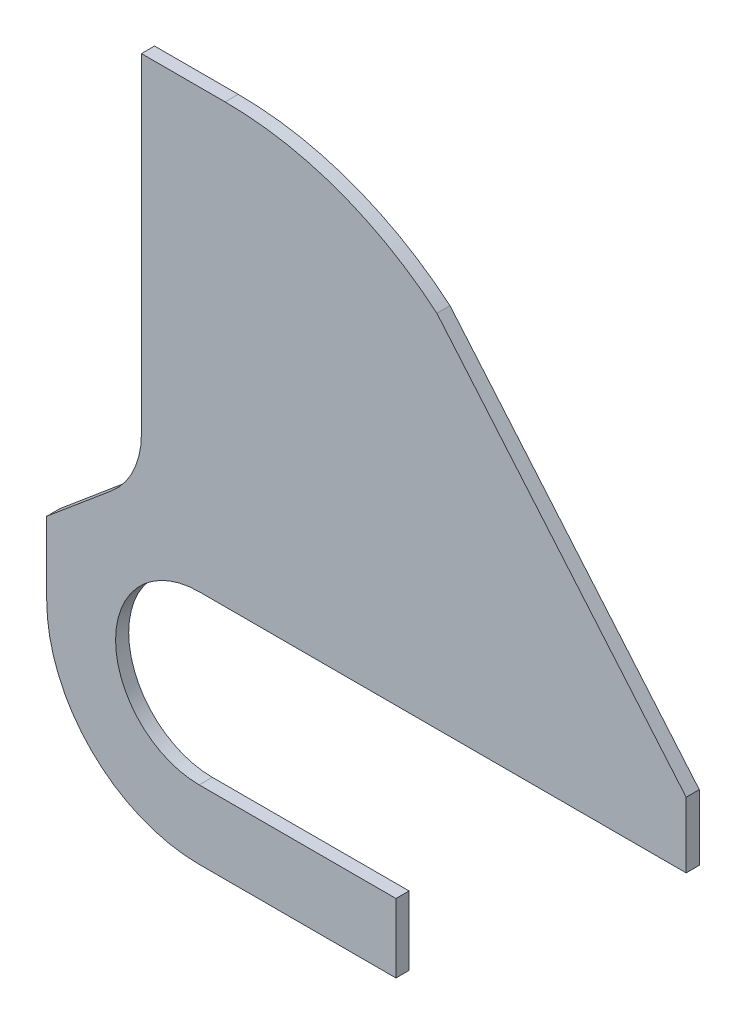
ISO-10303-21;
HEADER;
FILE_DESCRIPTION(('STEP AP214'),'2;1');
FILE_NAME('part.step','',(''),(''),'','','');
FILE_SCHEMA(('AUTOMOTIVE_DESIGN { 1 0 10303 214 1 1 1 1 }'));
ENDSEC;
DATA;
#1=APPLICATION_CONTEXT('core data for automotive mechanical design processes');
#2=APPLICATION_PROTOCOL_DEFINITION('international standard','automotive_design',2000,#1);
#3=PRODUCT_CONTEXT('',#1,'mechanical');
#4=PRODUCT('Part','Part','',(#3));
#5=PRODUCT_RELATED_PRODUCT_CATEGORY('part','',(#4));
#6=PRODUCT_DEFINITION_FORMATION('','',#4);
#7=PRODUCT_DEFINITION_CONTEXT('part definition',#1,'design');
#8=PRODUCT_DEFINITION('design','',#6,#7);
#9=PRODUCT_DEFINITION_SHAPE('','',#8);
#10=(LENGTH_UNIT() NAMED_UNIT(*) SI_UNIT(.MILLI.,.METRE.));
#11=(NAMED_UNIT(*) PLANE_ANGLE_UNIT() SI_UNIT($,.RADIAN.));
#12=(NAMED_UNIT(*) SI_UNIT($,.STERADIAN.) SOLID_ANGLE_UNIT());
#13=UNCERTAINTY_MEASURE_WITH_UNIT(LENGTH_MEASURE(1.E-05),#10,'distance_accuracy_value','');
#14=(GEOMETRIC_REPRESENTATION_CONTEXT(3) GLOBAL_UNCERTAINTY_ASSIGNED_CONTEXT((#13)) GLOBAL_UNIT_ASSIGNED_CONTEXT((#10,
#11,#12)) REPRESENTATION_CONTEXT('',''));
#15=CARTESIAN_POINT('',(0.,0.,0.));
#16=DIRECTION('',(0.,0.,1.));
#17=DIRECTION('',(1.,0.,0.));
#18=AXIS2_PLACEMENT_3D('',#15,#16,#17);
#19=CARTESIAN_POINT('',(-692.36812322296,756.238006891111,4.));
#20=DIRECTION('',(0.,-1.,0.));
#21=DIRECTION('',(0.,0.,-1.));
#22=AXIS2_PLACEMENT_3D('',#19,#20,#21);
#23=PLANE('',#22);
#24=DIRECTION('',(-1.,0.,0.));
#25=VECTOR('',#24,1.);
#26=CARTESIAN_POINT('',(-692.36812322296,756.238006891111,-4.));
#27=LINE('',#26,#25);
#28=CARTESIAN_POINT('',(-692.36812322296,756.238006891111,-4.));
#29=VERTEX_POINT('',#28);
#30=CARTESIAN_POINT('',(-812.36812322296,756.238006891111,-4.));
#31=VERTEX_POINT('',#30);
#32=EDGE_CURVE('E175',#29,#31,#27,.T.);
#33=ORIENTED_EDGE('',*,*,#32,.T.);
#34=DIRECTION('',(0.,0.,-1.));
#35=VECTOR('',#34,1.);
#36=CARTESIAN_POINT('',(-812.36812322296,756.238006891111,4.));
#37=LINE('',#36,#35);
#38=CARTESIAN_POINT('',(-812.36812322296,756.238006891111,4.));
#39=VERTEX_POINT('',#38);
#40=EDGE_CURVE('E11',#39,#31,#37,.T.);
#41=ORIENTED_EDGE('',*,*,#40,.F.);
#42=DIRECTION('',(-1.,0.,0.));
#43=VECTOR('',#42,1.);
#44=CARTESIAN_POINT('',(-692.36812322296,756.238006891111,4.));
#45=LINE('',#44,#43);
#46=CARTESIAN_POINT('',(-692.36812322296,756.238006891111,4.));
#47=VERTEX_POINT('',#46);
#48=EDGE_CURVE('E201',#47,#39,#45,.T.);
#49=ORIENTED_EDGE('',*,*,#48,.F.);
#50=DIRECTION('',(0.,0.,-1.));
#51=VECTOR('',#50,1.);
#52=CARTESIAN_POINT('',(-692.36812322296,756.238006891111,4.));
#53=LINE('',#52,#51);
#54=EDGE_CURVE('E171',#47,#29,#53,.T.);
#55=ORIENTED_EDGE('',*,*,#54,.T.);
#56=EDGE_LOOP('',(#33,#41,#49,#55));
#57=FACE_BOUND('',#56,.T.);
#58=ADVANCED_FACE('F43',(#57),#23,.F.);
#59=CARTESIAN_POINT('',(-812.368123222959,807.238006891111,4.));
#60=DIRECTION('',(0.,0.,-1.));
#61=DIRECTION('',(-1.,0.,0.));
#62=AXIS2_PLACEMENT_3D('',#59,#60,#61);
#63=CYLINDRICAL_SURFACE('',#62,51.);
#64=CARTESIAN_POINT('',(-812.368123222959,807.238006891111,-4.));
#65=DIRECTION('',(0.,0.,-1.));
#66=DIRECTION('',(-1.,0.,0.));
#67=AXIS2_PLACEMENT_3D('',#64,#65,#66);
#68=CIRCLE('',#67,51.);
#69=CARTESIAN_POINT('',(-812.368123222959,858.238006891111,-4.));
#70=VERTEX_POINT('',#69);
#71=EDGE_CURVE('E178',#31,#70,#68,.T.);
#72=ORIENTED_EDGE('',*,*,#71,.T.);
#73=DIRECTION('',(0.,0.,-1.));
#74=VECTOR('',#73,1.);
#75=CARTESIAN_POINT('',(-812.368123222959,858.238006891111,4.));
#76=LINE('',#75,#74);
#77=CARTESIAN_POINT('',(-812.368123222959,858.238006891111,4.));
#78=VERTEX_POINT('',#77);
#79=EDGE_CURVE('E51',#78,#70,#76,.T.);
#80=ORIENTED_EDGE('',*,*,#79,.F.);
#81=CARTESIAN_POINT('',(-812.368123222959,807.238006891111,4.));
#82=DIRECTION('',(0.,0.,-1.));
#83=DIRECTION('',(-1.,0.,0.));
#84=AXIS2_PLACEMENT_3D('',#81,#82,#83);
#85=CIRCLE('',#84,51.);
#86=EDGE_CURVE('E120',#39,#78,#85,.T.);
#87=ORIENTED_EDGE('',*,*,#86,.F.);
#88=ORIENTED_EDGE('',*,*,#40,.T.);
#89=EDGE_LOOP('',(#72,#80,#87,#88));
#90=FACE_BOUND('',#89,.T.);
#91=ADVANCED_FACE('F289',(#90),#63,.F.);
#92=CARTESIAN_POINT('',(-812.368123222959,858.238006891111,4.));
#93=DIRECTION('',(0.,1.,0.));
#94=DIRECTION('',(-1.,0.,0.));
#95=AXIS2_PLACEMENT_3D('',#92,#93,#94);
#96=PLANE('',#95);
#97=DIRECTION('',(1.,0.,0.));
#98=VECTOR('',#97,1.);
#99=CARTESIAN_POINT('',(-812.368123222959,858.238006891111,-4.));
#100=LINE('',#99,#98);
#101=CARTESIAN_POINT('',(-515.368123222948,858.2380068911,-4.));
#102=VERTEX_POINT('',#101);
#103=EDGE_CURVE('E180',#70,#102,#100,.T.);
#104=ORIENTED_EDGE('',*,*,#103,.T.);
#105=DIRECTION('',(0.,0.,-1.));
#106=VECTOR('',#105,1.);
#107=CARTESIAN_POINT('',(-515.368123222948,858.2380068911,4.));
#108=LINE('',#107,#106);
#109=CARTESIAN_POINT('',(-515.368123222948,858.2380068911,4.));
#110=VERTEX_POINT('',#109);
#111=EDGE_CURVE('E226',#110,#102,#108,.T.);
#112=ORIENTED_EDGE('',*,*,#111,.F.);
#113=DIRECTION('',(1.,0.,0.));
#114=VECTOR('',#113,1.);
#115=CARTESIAN_POINT('',(-812.368123222959,858.238006891111,4.));
#116=LINE('',#115,#114);
#117=EDGE_CURVE('E234',#78,#110,#116,.T.);
#118=ORIENTED_EDGE('',*,*,#117,.F.);
#119=ORIENTED_EDGE('',*,*,#79,.T.);
#120=EDGE_LOOP('',(#104,#112,#118,#119));
#121=FACE_BOUND('',#120,.T.);
#122=ADVANCED_FACE('F232',(#121),#96,.F.);
#123=CARTESIAN_POINT('',(-515.368123222948,858.2380068911,4.));
#124=DIRECTION('',(-1.,0.,0.));
#125=DIRECTION('',(0.,0.,1.));
#126=AXIS2_PLACEMENT_3D('',#123,#124,#125);
#127=PLANE('',#126);
#128=DIRECTION('',(0.,1.,0.));
#129=VECTOR('',#128,1.);
#130=CARTESIAN_POINT('',(-515.368123222948,858.2380068911,-4.));
#131=LINE('',#130,#129);
#132=CARTESIAN_POINT('',(-515.368123222948,898.238006891086,-4.));
#133=VERTEX_POINT('',#132);
#134=EDGE_CURVE('E182',#102,#133,#131,.T.);
#135=ORIENTED_EDGE('',*,*,#134,.T.);
#136=DIRECTION('',(0.,0.,-1.));
#137=VECTOR('',#136,1.);
#138=CARTESIAN_POINT('',(-515.368123222948,898.238006891086,4.));
#139=LINE('',#138,#137);
#140=CARTESIAN_POINT('',(-515.368123222948,898.238006891086,4.));
#141=VERTEX_POINT('',#140);
#142=EDGE_CURVE('E223',#141,#133,#139,.T.);
#143=ORIENTED_EDGE('',*,*,#142,.F.);
#144=DIRECTION('',(0.,1.,0.));
#145=VECTOR('',#144,1.);
#146=CARTESIAN_POINT('',(-515.368123222948,858.2380068911,4.));
#147=LINE('',#146,#145);
#148=EDGE_CURVE('E252',#110,#141,#147,.T.);
#149=ORIENTED_EDGE('',*,*,#148,.F.);
#150=ORIENTED_EDGE('',*,*,#111,.T.);
#151=EDGE_LOOP('',(#135,#143,#149,#150));
#152=FACE_BOUND('',#151,.T.);
#153=ADVANCED_FACE('F243',(#152),#127,.F.);
#154=CARTESIAN_POINT('',(-667.419030076104,1077.86407610393,4.));
#155=DIRECTION('',(-0.763261355733497,-0.646089856632857,0.));
#156=DIRECTION('',(0.646089856632857,-0.763261355733497,0.));
#157=AXIS2_PLACEMENT_3D('',#154,#155,#156);
#158=PLANE('',#157);
#159=DIRECTION('',(-0.646089856632856,0.763261355733496,0.));
#160=VECTOR('',#159,1.);
#161=CARTESIAN_POINT('',(-667.419030076104,1077.86407610393,-4.));
#162=LINE('',#161,#160);
#163=CARTESIAN_POINT('',(-667.419030076104,1077.86407610393,-4.));
#164=VERTEX_POINT('',#163);
#165=EDGE_CURVE('E184',#133,#164,#162,.T.);
#166=ORIENTED_EDGE('',*,*,#165,.T.);
#167=DIRECTION('',(0.,0.,-1.));
#168=VECTOR('',#167,1.);
#169=CARTESIAN_POINT('',(-667.419030076104,1077.86407610393,4.));
#170=LINE('',#169,#168);
#171=CARTESIAN_POINT('',(-667.419030076104,1077.86407610393,4.));
#172=VERTEX_POINT('',#171);
#173=EDGE_CURVE('E220',#172,#164,#170,.T.);
#174=ORIENTED_EDGE('',*,*,#173,.F.);
#175=DIRECTION('',(-0.646089856632856,0.763261355733496,0.));
#176=VECTOR('',#175,1.);
#177=CARTESIAN_POINT('',(-667.419030076104,1077.86407610393,4.));
#178=LINE('',#177,#176);
#179=EDGE_CURVE('E249',#141,#172,#178,.T.);
#180=ORIENTED_EDGE('',*,*,#179,.F.);
#181=ORIENTED_EDGE('',*,*,#142,.T.);
#182=EDGE_LOOP('',(#166,#174,#180,#181));
#183=FACE_BOUND('',#182,.T.);
#184=ADVANCED_FACE('F247',(#183),#158,.F.);
#185=CARTESIAN_POINT('',(-796.619339623095,923.889143037008,4.));
#186=DIRECTION('',(0.,0.,-1.));
#187=DIRECTION('',(-1.,0.,0.));
#188=AXIS2_PLACEMENT_3D('',#185,#186,#187);
#189=CYLINDRICAL_SURFACE('',#188,201.);
#190=CARTESIAN_POINT('',(-796.619339623095,923.889143037008,-4.));
#191=DIRECTION('',(0.,0.,1.));
#192=DIRECTION('',(1.,0.,0.));
#193=AXIS2_PLACEMENT_3D('',#190,#191,#192);
#194=CIRCLE('',#193,201.);
#195=CARTESIAN_POINT('',(-796.619339623097,1124.88914303701,-4.));
#196=VERTEX_POINT('',#195);
#197=EDGE_CURVE('E186',#164,#196,#194,.T.);
#198=ORIENTED_EDGE('',*,*,#197,.T.);
#199=DIRECTION('',(0.,0.,-1.));
#200=VECTOR('',#199,1.);
#201=CARTESIAN_POINT('',(-796.619339623097,1124.88914303701,4.));
#202=LINE('',#201,#200);
#203=CARTESIAN_POINT('',(-796.619339623097,1124.88914303701,4.));
#204=VERTEX_POINT('',#203);
#205=EDGE_CURVE('E217',#204,#196,#202,.T.);
#206=ORIENTED_EDGE('',*,*,#205,.F.);
#207=CARTESIAN_POINT('',(-796.619339623095,923.889143037008,4.));
#208=DIRECTION('',(0.,0.,1.));
#209=DIRECTION('',(1.,0.,0.));
#210=AXIS2_PLACEMENT_3D('',#207,#208,#209);
#211=CIRCLE('',#210,201.);
#212=EDGE_CURVE('E251',#172,#204,#211,.T.);
#213=ORIENTED_EDGE('',*,*,#212,.F.);
#214=ORIENTED_EDGE('',*,*,#173,.T.);
#215=EDGE_LOOP('',(#198,#206,#213,#214));
#216=FACE_BOUND('',#215,.T.);
#217=ADVANCED_FACE('F302',(#216),#189,.T.);
#218=CARTESIAN_POINT('',(-847.619339623095,1124.88914303701,4.));
#219=DIRECTION('',(0.,-1.,0.));
#220=DIRECTION('',(0.,0.,-1.));
#221=AXIS2_PLACEMENT_3D('',#218,#219,#220);
#222=PLANE('',#221);
#223=DIRECTION('',(-1.,0.,0.));
#224=VECTOR('',#223,1.);
#225=CARTESIAN_POINT('',(-847.619339623095,1124.88914303701,-4.));
#226=LINE('',#225,#224);
#227=CARTESIAN_POINT('',(-847.619339623095,1124.88914303701,-4.));
#228=VERTEX_POINT('',#227);
#229=EDGE_CURVE('E188',#196,#228,#226,.T.);
#230=ORIENTED_EDGE('',*,*,#229,.T.);
#231=DIRECTION('',(0.,0.,-1.));
#232=VECTOR('',#231,1.);
#233=CARTESIAN_POINT('',(-847.619339623095,1124.88914303701,4.));
#234=LINE('',#233,#232);
#235=CARTESIAN_POINT('',(-847.619339623095,1124.88914303701,4.));
#236=VERTEX_POINT('',#235);
#237=EDGE_CURVE('E214',#236,#228,#234,.T.);
#238=ORIENTED_EDGE('',*,*,#237,.F.);
#239=DIRECTION('',(-1.,0.,0.));
#240=VECTOR('',#239,1.);
#241=CARTESIAN_POINT('',(-847.619339623095,1124.88914303701,4.));
#242=LINE('',#241,#240);
#243=EDGE_CURVE('E254',#204,#236,#242,.T.);
#244=ORIENTED_EDGE('',*,*,#243,.F.);
#245=ORIENTED_EDGE('',*,*,#205,.T.);
#246=EDGE_LOOP('',(#230,#238,#244,#245));
#247=FACE_BOUND('',#246,.T.);
#248=ADVANCED_FACE('F305',(#247),#222,.F.);
#249=CARTESIAN_POINT('',(-847.619339623095,923.889143037008,4.));
#250=DIRECTION('',(1.,0.,0.));
#251=DIRECTION('',(0.,0.,-1.));
#252=AXIS2_PLACEMENT_3D('',#249,#250,#251);
#253=PLANE('',#252);
#254=DIRECTION('',(0.,-1.,0.));
#255=VECTOR('',#254,1.);
#256=CARTESIAN_POINT('',(-847.619339623095,923.889143037008,-4.));
#257=LINE('',#256,#255);
#258=CARTESIAN_POINT('',(-847.619339623095,923.889143037008,-4.));
#259=VERTEX_POINT('',#258);
#260=EDGE_CURVE('E190',#228,#259,#257,.T.);
#261=ORIENTED_EDGE('',*,*,#260,.T.);
#262=DIRECTION('',(0.,0.,-1.));
#263=VECTOR('',#262,1.);
#264=CARTESIAN_POINT('',(-847.619339623095,923.889143037008,4.));
#265=LINE('',#264,#263);
#266=CARTESIAN_POINT('',(-847.619339623095,923.889143037008,4.));
#267=VERTEX_POINT('',#266);
#268=EDGE_CURVE('E211',#267,#259,#265,.T.);
#269=ORIENTED_EDGE('',*,*,#268,.F.);
#270=DIRECTION('',(0.,-1.,0.));
#271=VECTOR('',#270,1.);
#272=CARTESIAN_POINT('',(-847.619339623095,923.889143037008,4.));
#273=LINE('',#272,#271);
#274=EDGE_CURVE('E260',#236,#267,#273,.T.);
#275=ORIENTED_EDGE('',*,*,#274,.F.);
#276=ORIENTED_EDGE('',*,*,#237,.T.);
#277=EDGE_LOOP('',(#261,#269,#275,#276));
#278=FACE_BOUND('',#277,.T.);
#279=ADVANCED_FACE('F309',(#278),#253,.F.);
#280=CARTESIAN_POINT('',(-898.619339623095,923.889143037008,4.));
#281=DIRECTION('',(0.,0.,-1.));
#282=DIRECTION('',(-1.,0.,0.));
#283=AXIS2_PLACEMENT_3D('',#280,#281,#282);
#284=CYLINDRICAL_SURFACE('',#283,51.);
#285=CARTESIAN_POINT('',(-898.619339623095,923.889143037008,-4.));
#286=DIRECTION('',(0.,0.,-1.));
#287=DIRECTION('',(-1.,0.,0.));
#288=AXIS2_PLACEMENT_3D('',#285,#286,#287);
#289=CIRCLE('',#288,51.);
#290=CARTESIAN_POINT('',(-865.837171529082,884.820876437939,-4.));
#291=VERTEX_POINT('',#290);
#292=EDGE_CURVE('E192',#259,#291,#289,.T.);
#293=ORIENTED_EDGE('',*,*,#292,.T.);
#294=DIRECTION('',(0.,0.,-1.));
#295=VECTOR('',#294,1.);
#296=CARTESIAN_POINT('',(-865.837171529082,884.820876437939,4.));
#297=LINE('',#296,#295);
#298=CARTESIAN_POINT('',(-865.837171529082,884.820876437939,4.));
#299=VERTEX_POINT('',#298);
#300=EDGE_CURVE('E208',#299,#291,#297,.T.);
#301=ORIENTED_EDGE('',*,*,#300,.F.);
#302=CARTESIAN_POINT('',(-898.619339623095,923.889143037008,4.));
#303=DIRECTION('',(0.,0.,-1.));
#304=DIRECTION('',(-1.,0.,0.));
#305=AXIS2_PLACEMENT_3D('',#302,#303,#304);
#306=CIRCLE('',#305,51.);
#307=EDGE_CURVE('E262',#267,#299,#306,.T.);
#308=ORIENTED_EDGE('',*,*,#307,.F.);
#309=ORIENTED_EDGE('',*,*,#268,.T.);
#310=EDGE_LOOP('',(#293,#301,#308,#309));
#311=FACE_BOUND('',#310,.T.);
#312=ADVANCED_FACE('F313',(#311),#284,.F.);
#313=CARTESIAN_POINT('',(-905.368123222959,851.650469451522,4.));
#314=DIRECTION('',(0.642787609686519,-0.766044443118995,0.));
#315=DIRECTION('',(0.766044443118995,0.642787609686519,0.));
#316=AXIS2_PLACEMENT_3D('',#313,#314,#315);
#317=PLANE('',#316);
#318=DIRECTION('',(-0.766044443118995,-0.642787609686519,0.));
#319=VECTOR('',#318,1.);
#320=CARTESIAN_POINT('',(-905.368123222959,851.650469451522,-4.));
#321=LINE('',#320,#319);
#322=CARTESIAN_POINT('',(-905.368123222959,851.650469451522,-4.));
#323=VERTEX_POINT('',#322);
#324=EDGE_CURVE('E194',#291,#323,#321,.T.);
#325=ORIENTED_EDGE('',*,*,#324,.T.);
#326=DIRECTION('',(0.,0.,-1.));
#327=VECTOR('',#326,1.);
#328=CARTESIAN_POINT('',(-905.368123222959,851.650469451522,4.));
#329=LINE('',#328,#327);
#330=CARTESIAN_POINT('',(-905.368123222959,851.650469451522,4.));
#331=VERTEX_POINT('',#330);
#332=EDGE_CURVE('E205',#331,#323,#329,.T.);
#333=ORIENTED_EDGE('',*,*,#332,.F.);
#334=DIRECTION('',(-0.766044443118995,-0.642787609686519,0.));
#335=VECTOR('',#334,1.);
#336=CARTESIAN_POINT('',(-905.368123222959,851.650469451522,4.));
#337=LINE('',#336,#335);
#338=EDGE_CURVE('E264',#299,#331,#337,.T.);
#339=ORIENTED_EDGE('',*,*,#338,.F.);
#340=ORIENTED_EDGE('',*,*,#300,.T.);
#341=EDGE_LOOP('',(#325,#333,#339,#340));
#342=FACE_BOUND('',#341,.T.);
#343=ADVANCED_FACE('F270',(#342),#317,.F.);
#344=CARTESIAN_POINT('',(-905.368123222959,807.238006891112,4.));
#345=DIRECTION('',(1.,0.,0.));
#346=DIRECTION('',(0.,0.,-1.));
#347=AXIS2_PLACEMENT_3D('',#344,#345,#346);
#348=PLANE('',#347);
#349=DIRECTION('',(0.,-1.,0.));
#350=VECTOR('',#349,1.);
#351=CARTESIAN_POINT('',(-905.368123222959,807.238006891112,-4.));
#352=LINE('',#351,#350);
#353=CARTESIAN_POINT('',(-905.368123222959,807.238006891111,-4.));
#354=VERTEX_POINT('',#353);
#355=EDGE_CURVE('E196',#323,#354,#352,.T.);
#356=ORIENTED_EDGE('',*,*,#355,.T.);
#357=DIRECTION('',(0.,0.,-1.));
#358=VECTOR('',#357,1.);
#359=CARTESIAN_POINT('',(-905.368123222959,807.238006891111,4.));
#360=LINE('',#359,#358);
#361=CARTESIAN_POINT('',(-905.368123222959,807.238006891111,4.));
#362=VERTEX_POINT('',#361);
#363=EDGE_CURVE('E166',#362,#354,#360,.T.);
#364=ORIENTED_EDGE('',*,*,#363,.F.);
#365=DIRECTION('',(0.,-1.,0.));
#366=VECTOR('',#365,1.);
#367=CARTESIAN_POINT('',(-905.368123222959,807.238006891112,4.));
#368=LINE('',#367,#366);
#369=EDGE_CURVE('E157',#331,#362,#368,.T.);
#370=ORIENTED_EDGE('',*,*,#369,.F.);
#371=ORIENTED_EDGE('',*,*,#332,.T.);
#372=EDGE_LOOP('',(#356,#364,#370,#371));
#373=FACE_BOUND('',#372,.T.);
#374=ADVANCED_FACE('F274',(#373),#348,.F.);
#375=CARTESIAN_POINT('',(-812.368123222959,807.238006891111,4.));
#376=DIRECTION('',(0.,0.,-1.));
#377=DIRECTION('',(-1.,0.,0.));
#378=AXIS2_PLACEMENT_3D('',#375,#376,#377);
#379=CYLINDRICAL_SURFACE('',#378,93.0000000000001);
#380=CARTESIAN_POINT('',(-812.368123222959,807.238006891111,-4.));
#381=DIRECTION('',(0.,0.,1.));
#382=DIRECTION('',(-1.,0.,0.));
#383=AXIS2_PLACEMENT_3D('',#380,#381,#382);
#384=CIRCLE('',#383,93.0000000000001);
#385=CARTESIAN_POINT('',(-812.36812322296,714.238006891111,-4.));
#386=VERTEX_POINT('',#385);
#387=EDGE_CURVE('E165',#354,#386,#384,.T.);
#388=ORIENTED_EDGE('',*,*,#387,.T.);
#389=DIRECTION('',(0.,0.,-1.));
#390=VECTOR('',#389,1.);
#391=CARTESIAN_POINT('',(-812.36812322296,714.238006891111,4.));
#392=LINE('',#391,#390);
#393=CARTESIAN_POINT('',(-812.36812322296,714.238006891111,4.));
#394=VERTEX_POINT('',#393);
#395=EDGE_CURVE('E162',#394,#386,#392,.T.);
#396=ORIENTED_EDGE('',*,*,#395,.F.);
#397=CARTESIAN_POINT('',(-812.368123222959,807.238006891111,4.));
#398=DIRECTION('',(0.,0.,1.));
#399=DIRECTION('',(-1.,0.,0.));
#400=AXIS2_PLACEMENT_3D('',#397,#398,#399);
#401=CIRCLE('',#400,93.0000000000001);
#402=EDGE_CURVE('E151',#362,#394,#401,.T.);
#403=ORIENTED_EDGE('',*,*,#402,.F.);
#404=ORIENTED_EDGE('',*,*,#363,.T.);
#405=EDGE_LOOP('',(#388,#396,#403,#404));
#406=FACE_BOUND('',#405,.T.);
#407=ADVANCED_FACE('F163',(#406),#379,.T.);
#408=CARTESIAN_POINT('',(-812.36812322296,714.238006891111,4.));
#409=DIRECTION('',(0.,1.,0.));
#410=DIRECTION('',(0.,0.,1.));
#411=AXIS2_PLACEMENT_3D('',#408,#409,#410);
#412=PLANE('',#411);
#413=DIRECTION('',(1.,0.,0.));
#414=VECTOR('',#413,1.);
#415=CARTESIAN_POINT('',(-812.36812322296,714.238006891111,-4.));
#416=LINE('',#415,#414);
#417=CARTESIAN_POINT('',(-692.36812322296,714.238006891111,-4.));
#418=VERTEX_POINT('',#417);
#419=EDGE_CURVE('E106',#386,#418,#416,.T.);
#420=ORIENTED_EDGE('',*,*,#419,.T.);
#421=DIRECTION('',(0.,0.,-1.));
#422=VECTOR('',#421,1.);
#423=CARTESIAN_POINT('',(-692.36812322296,714.238006891111,4.));
#424=LINE('',#423,#422);
#425=CARTESIAN_POINT('',(-692.36812322296,714.238006891111,4.));
#426=VERTEX_POINT('',#425);
#427=EDGE_CURVE('E167',#426,#418,#424,.T.);
#428=ORIENTED_EDGE('',*,*,#427,.F.);
#429=DIRECTION('',(1.,0.,0.));
#430=VECTOR('',#429,1.);
#431=CARTESIAN_POINT('',(-812.36812322296,714.238006891111,4.));
#432=LINE('',#431,#430);
#433=EDGE_CURVE('E155',#394,#426,#432,.T.);
#434=ORIENTED_EDGE('',*,*,#433,.F.);
#435=ORIENTED_EDGE('',*,*,#395,.T.);
#436=EDGE_LOOP('',(#420,#428,#434,#435));
#437=FACE_BOUND('',#436,.T.);
#438=ADVANCED_FACE('F169',(#437),#412,.F.);
#439=CARTESIAN_POINT('',(-692.36812322296,756.238006891111,4.));
#440=DIRECTION('',(-1.,0.,0.));
#441=DIRECTION('',(0.,0.,1.));
#442=AXIS2_PLACEMENT_3D('',#439,#440,#441);
#443=PLANE('',#442);
#444=DIRECTION('',(0.,1.,0.));
#445=VECTOR('',#444,1.);
#446=CARTESIAN_POINT('',(-692.36812322296,756.238006891111,-4.));
#447=LINE('',#446,#445);
#448=EDGE_CURVE('E112',#418,#29,#447,.T.);
#449=ORIENTED_EDGE('',*,*,#448,.T.);
#450=ORIENTED_EDGE('',*,*,#54,.F.);
#451=DIRECTION('',(0.,1.,0.));
#452=VECTOR('',#451,1.);
#453=CARTESIAN_POINT('',(-692.36812322296,756.238006891111,4.));
#454=LINE('',#453,#452);
#455=EDGE_CURVE('E59',#426,#47,#454,.T.);
#456=ORIENTED_EDGE('',*,*,#455,.F.);
#457=ORIENTED_EDGE('',*,*,#427,.T.);
#458=EDGE_LOOP('',(#449,#450,#456,#457));
#459=FACE_BOUND('',#458,.T.);
#460=ADVANCED_FACE('F278',(#459),#443,.F.);
#461=CARTESIAN_POINT('',(-812.368123222959,807.238006891111,4.));
#462=DIRECTION('',(0.,0.,-1.));
#463=DIRECTION('',(-1.,0.,0.));
#464=AXIS2_PLACEMENT_3D('',#461,#462,#463);
#465=PLANE('',#464);
#466=ORIENTED_EDGE('',*,*,#48,.T.);
#467=ORIENTED_EDGE('',*,*,#86,.T.);
#468=ORIENTED_EDGE('',*,*,#117,.T.);
#469=ORIENTED_EDGE('',*,*,#148,.T.);
#470=ORIENTED_EDGE('',*,*,#179,.T.);
#471=ORIENTED_EDGE('',*,*,#212,.T.);
#472=ORIENTED_EDGE('',*,*,#243,.T.);
#473=ORIENTED_EDGE('',*,*,#274,.T.);
#474=ORIENTED_EDGE('',*,*,#307,.T.);
#475=ORIENTED_EDGE('',*,*,#338,.T.);
#476=ORIENTED_EDGE('',*,*,#369,.T.);
#477=ORIENTED_EDGE('',*,*,#402,.T.);
#478=ORIENTED_EDGE('',*,*,#433,.T.);
#479=ORIENTED_EDGE('',*,*,#455,.T.);
#480=EDGE_LOOP('',(#466,#467,#468,#469,#470,#471,#472,#473,#474,#475,#476,#477,#478,#479));
#481=FACE_BOUND('',#480,.T.);
#482=ADVANCED_FACE('F153',(#481),#465,.F.);
#483=CARTESIAN_POINT('',(-812.368123222959,807.238006891111,-4.));
#484=DIRECTION('',(0.,0.,-1.));
#485=DIRECTION('',(-1.,0.,0.));
#486=AXIS2_PLACEMENT_3D('',#483,#484,#485);
#487=PLANE('',#486);
#488=ORIENTED_EDGE('',*,*,#32,.F.);
#489=ORIENTED_EDGE('',*,*,#448,.F.);
#490=ORIENTED_EDGE('',*,*,#419,.F.);
#491=ORIENTED_EDGE('',*,*,#387,.F.);
#492=ORIENTED_EDGE('',*,*,#355,.F.);
#493=ORIENTED_EDGE('',*,*,#324,.F.);
#494=ORIENTED_EDGE('',*,*,#292,.F.);
#495=ORIENTED_EDGE('',*,*,#260,.F.);
#496=ORIENTED_EDGE('',*,*,#229,.F.);
#497=ORIENTED_EDGE('',*,*,#197,.F.);
#498=ORIENTED_EDGE('',*,*,#165,.F.);
#499=ORIENTED_EDGE('',*,*,#134,.F.);
#500=ORIENTED_EDGE('',*,*,#103,.F.);
#501=ORIENTED_EDGE('',*,*,#71,.F.);
#502=EDGE_LOOP('',(#488,#489,#490,#491,#492,#493,#494,#495,#496,#497,#498,#499,#500,#501));
#503=FACE_BOUND('',#502,.T.);
#504=ADVANCED_FACE('F238',(#503),#487,.T.);
#505=CLOSED_SHELL('',(#58,#91,#122,#153,#184,#217,#248,#279,#312,#343,#374,#407,#438,#460,#482,#504));
#506=MANIFOLD_SOLID_BREP('B2',#505);
#507=ADVANCED_BREP_SHAPE_REPRESENTATION('',(#18,#506),#14);
#508=SHAPE_DEFINITION_REPRESENTATION(#9,#507);
ENDSEC;
END-ISO-10303-21;
